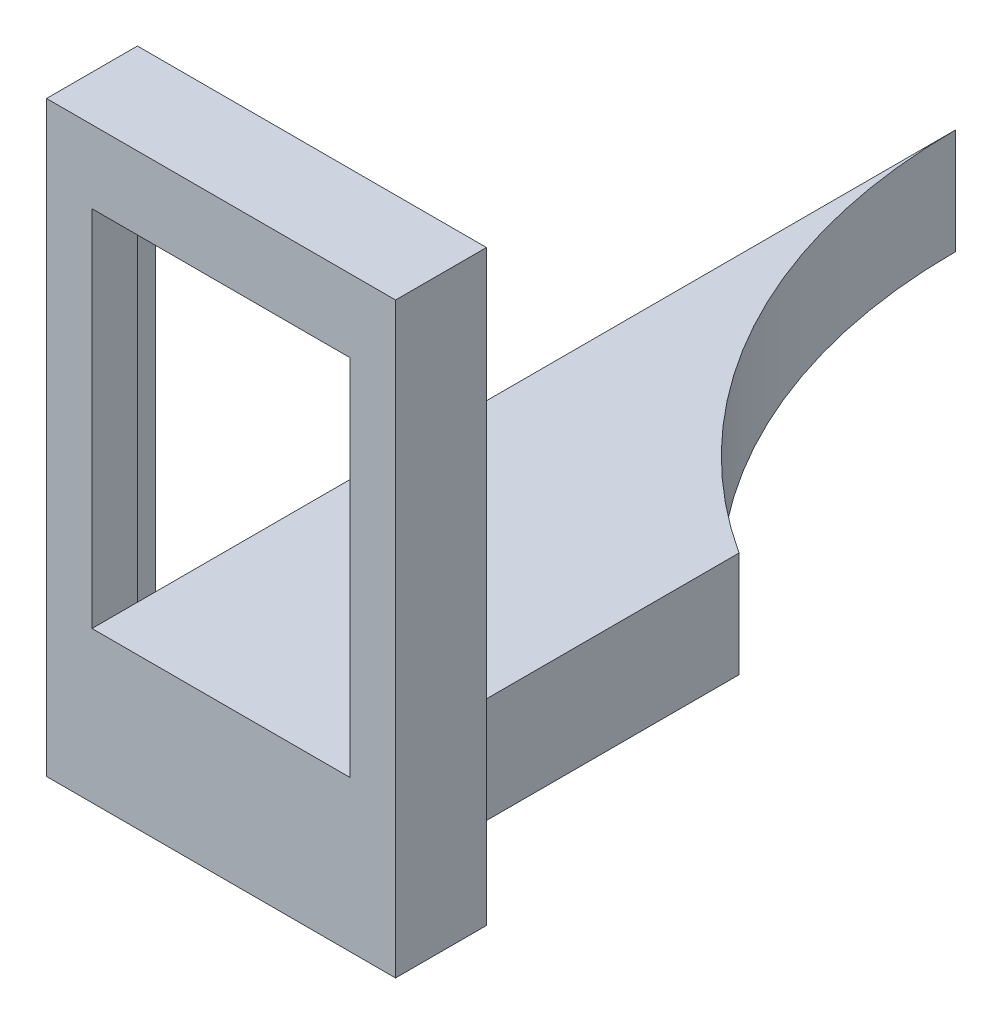
ISO-10303-21;
HEADER;
FILE_DESCRIPTION(('STEP AP214'),'2;1');
FILE_NAME('part.step','',(''),(''),'','','');
FILE_SCHEMA(('AUTOMOTIVE_DESIGN { 1 0 10303 214 1 1 1 1 }'));
ENDSEC;
DATA;
#1=APPLICATION_CONTEXT('core data for automotive mechanical design processes');
#2=APPLICATION_PROTOCOL_DEFINITION('international standard','automotive_design',2000,#1);
#3=PRODUCT_CONTEXT('',#1,'mechanical');
#4=PRODUCT('Part','Part','',(#3));
#5=PRODUCT_RELATED_PRODUCT_CATEGORY('part','',(#4));
#6=PRODUCT_DEFINITION_FORMATION('','',#4);
#7=PRODUCT_DEFINITION_CONTEXT('part definition',#1,'design');
#8=PRODUCT_DEFINITION('design','',#6,#7);
#9=PRODUCT_DEFINITION_SHAPE('','',#8);
#10=(LENGTH_UNIT() NAMED_UNIT(*) SI_UNIT(.MILLI.,.METRE.));
#11=(NAMED_UNIT(*) PLANE_ANGLE_UNIT() SI_UNIT($,.RADIAN.));
#12=(NAMED_UNIT(*) SI_UNIT($,.STERADIAN.) SOLID_ANGLE_UNIT());
#13=UNCERTAINTY_MEASURE_WITH_UNIT(LENGTH_MEASURE(1.E-05),#10,'distance_accuracy_value','');
#14=(GEOMETRIC_REPRESENTATION_CONTEXT(3) GLOBAL_UNCERTAINTY_ASSIGNED_CONTEXT((#13)) GLOBAL_UNIT_ASSIGNED_CONTEXT((#10,
#11,#12)) REPRESENTATION_CONTEXT('',''));
#15=CARTESIAN_POINT('',(0.,0.,0.));
#16=DIRECTION('',(0.,0.,1.));
#17=DIRECTION('',(1.,0.,0.));
#18=AXIS2_PLACEMENT_3D('',#15,#16,#17);
#19=CARTESIAN_POINT('',(0.,0.,-5.));
#20=DIRECTION('',(0.,0.,1.));
#21=DIRECTION('',(1.,0.,0.));
#22=AXIS2_PLACEMENT_3D('',#19,#20,#21);
#23=PLANE('',#22);
#24=DIRECTION('',(0.,1.,0.));
#25=VECTOR('',#24,1.);
#26=CARTESIAN_POINT('',(31.4,2.99999999999999,-5.));
#27=LINE('',#26,#25);
#28=CARTESIAN_POINT('',(31.4,2.99999999999999,-5.));
#29=VERTEX_POINT('',#28);
#30=CARTESIAN_POINT('',(31.4,14.6,-5.));
#31=VERTEX_POINT('',#30);
#32=EDGE_CURVE('E282',#29,#31,#27,.T.);
#33=ORIENTED_EDGE('',*,*,#32,.T.);
#34=CARTESIAN_POINT('',(31.4,54.6,-5.));
#35=VERTEX_POINT('',#34);
#36=EDGE_CURVE('E281',#31,#35,#27,.T.);
#37=ORIENTED_EDGE('',*,*,#36,.T.);
#38=DIRECTION('',(-1.,0.,0.));
#39=VECTOR('',#38,1.);
#40=CARTESIAN_POINT('',(31.4,54.6,-5.));
#41=LINE('',#40,#39);
#42=CARTESIAN_POINT('',(3.,54.6,-5.));
#43=VERTEX_POINT('',#42);
#44=EDGE_CURVE('E267',#35,#43,#41,.T.);
#45=ORIENTED_EDGE('',*,*,#44,.T.);
#46=DIRECTION('',(0.,-1.,0.));
#47=VECTOR('',#46,1.);
#48=CARTESIAN_POINT('',(3.,54.6,-5.));
#49=LINE('',#48,#47);
#50=CARTESIAN_POINT('',(3.,14.6,-5.));
#51=VERTEX_POINT('',#50);
#52=EDGE_CURVE('E273',#43,#51,#49,.T.);
#53=ORIENTED_EDGE('',*,*,#52,.T.);
#54=CARTESIAN_POINT('',(3.,2.99999999999999,-5.));
#55=VERTEX_POINT('',#54);
#56=EDGE_CURVE('E271',#51,#55,#49,.T.);
#57=ORIENTED_EDGE('',*,*,#56,.T.);
#58=DIRECTION('',(1.,0.,0.));
#59=VECTOR('',#58,1.);
#60=CARTESIAN_POINT('',(3.,2.99999999999999,-5.));
#61=LINE('',#60,#59);
#62=EDGE_CURVE('E277',#55,#29,#61,.T.);
#63=ORIENTED_EDGE('',*,*,#62,.T.);
#64=EDGE_LOOP('',(#33,#37,#45,#53,#57,#63));
#65=FACE_BOUND('',#64,.T.);
#66=DIRECTION('',(-1.,0.,0.));
#67=VECTOR('',#66,1.);
#68=CARTESIAN_POINT('',(34.4,60.6,-5.));
#69=LINE('',#68,#67);
#70=CARTESIAN_POINT('',(34.4,60.6,-5.));
#71=VERTEX_POINT('',#70);
#72=CARTESIAN_POINT('',(0.,60.6,-5.));
#73=VERTEX_POINT('',#72);
#74=EDGE_CURVE('E156',#71,#73,#69,.T.);
#75=ORIENTED_EDGE('',*,*,#74,.F.);
#76=DIRECTION('',(0.,1.,0.));
#77=VECTOR('',#76,1.);
#78=CARTESIAN_POINT('',(34.4,0.,-5.));
#79=LINE('',#78,#77);
#80=CARTESIAN_POINT('',(34.4,0.,-5.));
#81=VERTEX_POINT('',#80);
#82=EDGE_CURVE('E48',#81,#71,#79,.T.);
#83=ORIENTED_EDGE('',*,*,#82,.F.);
#84=DIRECTION('',(1.,0.,0.));
#85=VECTOR('',#84,1.);
#86=CARTESIAN_POINT('',(0.,0.,-5.));
#87=LINE('',#86,#85);
#88=CARTESIAN_POINT('',(0.,0.,-5.));
#89=VERTEX_POINT('',#88);
#90=EDGE_CURVE('E306',#89,#81,#87,.T.);
#91=ORIENTED_EDGE('',*,*,#90,.F.);
#92=DIRECTION('',(0.,-1.,0.));
#93=VECTOR('',#92,1.);
#94=CARTESIAN_POINT('',(0.,60.6,-5.));
#95=LINE('',#94,#93);
#96=EDGE_CURVE('E303',#73,#89,#95,.T.);
#97=ORIENTED_EDGE('',*,*,#96,.F.);
#98=EDGE_LOOP('',(#75,#83,#91,#97));
#99=FACE_BOUND('',#98,.T.);
#100=ADVANCED_FACE('F39',(#65,#99),#23,.F.);
#101=CARTESIAN_POINT('',(0.,0.,0.));
#102=DIRECTION('',(0.,0.,1.));
#103=DIRECTION('',(1.,0.,0.));
#104=AXIS2_PLACEMENT_3D('',#101,#102,#103);
#105=PLANE('',#104);
#106=DIRECTION('',(0.,1.,0.));
#107=VECTOR('',#106,1.);
#108=CARTESIAN_POINT('',(31.4,2.99999999999999,0.));
#109=LINE('',#108,#107);
#110=CARTESIAN_POINT('',(31.4,14.6,0.));
#111=VERTEX_POINT('',#110);
#112=CARTESIAN_POINT('',(31.4,54.6,0.));
#113=VERTEX_POINT('',#112);
#114=EDGE_CURVE('E272',#111,#113,#109,.T.);
#115=ORIENTED_EDGE('',*,*,#114,.F.);
#116=DIRECTION('',(-1.,0.,0.));
#117=VECTOR('',#116,1.);
#118=CARTESIAN_POINT('',(3.,14.6,0.));
#119=LINE('',#118,#117);
#120=CARTESIAN_POINT('',(3.,14.6,0.));
#121=VERTEX_POINT('',#120);
#122=EDGE_CURVE('E245',#111,#121,#119,.T.);
#123=ORIENTED_EDGE('',*,*,#122,.T.);
#124=DIRECTION('',(0.,-1.,0.));
#125=VECTOR('',#124,1.);
#126=CARTESIAN_POINT('',(3.,54.6,0.));
#127=LINE('',#126,#125);
#128=CARTESIAN_POINT('',(3.,54.6,0.));
#129=VERTEX_POINT('',#128);
#130=EDGE_CURVE('E289',#129,#121,#127,.T.);
#131=ORIENTED_EDGE('',*,*,#130,.F.);
#132=DIRECTION('',(-1.,0.,0.));
#133=VECTOR('',#132,1.);
#134=CARTESIAN_POINT('',(31.4,54.6,0.));
#135=LINE('',#134,#133);
#136=EDGE_CURVE('E258',#113,#129,#135,.T.);
#137=ORIENTED_EDGE('',*,*,#136,.F.);
#138=EDGE_LOOP('',(#115,#123,#131,#137));
#139=FACE_BOUND('',#138,.T.);
#140=DIRECTION('',(0.,-1.,0.));
#141=VECTOR('',#140,1.);
#142=CARTESIAN_POINT('',(-2.00000000000001,-2.,0.));
#143=LINE('',#142,#141);
#144=CARTESIAN_POINT('',(-2.00000000000001,62.6,0.));
#145=VERTEX_POINT('',#144);
#146=CARTESIAN_POINT('',(-2.00000000000001,-2.,0.));
#147=VERTEX_POINT('',#146);
#148=EDGE_CURVE('E186',#145,#147,#143,.T.);
#149=ORIENTED_EDGE('',*,*,#148,.T.);
#150=DIRECTION('',(1.,0.,0.));
#151=VECTOR('',#150,1.);
#152=CARTESIAN_POINT('',(-2.00000000000001,-2.,0.));
#153=LINE('',#152,#151);
#154=CARTESIAN_POINT('',(36.4,-2.,0.));
#155=VERTEX_POINT('',#154);
#156=EDGE_CURVE('E214',#147,#155,#153,.T.);
#157=ORIENTED_EDGE('',*,*,#156,.T.);
#158=DIRECTION('',(0.,1.,0.));
#159=VECTOR('',#158,1.);
#160=CARTESIAN_POINT('',(36.4,-2.,0.));
#161=LINE('',#160,#159);
#162=CARTESIAN_POINT('',(36.4,62.6,0.));
#163=VERTEX_POINT('',#162);
#164=EDGE_CURVE('E218',#155,#163,#161,.T.);
#165=ORIENTED_EDGE('',*,*,#164,.T.);
#166=DIRECTION('',(-1.,0.,0.));
#167=VECTOR('',#166,1.);
#168=CARTESIAN_POINT('',(-2.00000000000001,62.6,0.));
#169=LINE('',#168,#167);
#170=EDGE_CURVE('E198',#163,#145,#169,.T.);
#171=ORIENTED_EDGE('',*,*,#170,.T.);
#172=EDGE_LOOP('',(#149,#157,#165,#171));
#173=FACE_BOUND('',#172,.T.);
#174=ADVANCED_FACE('F41',(#139,#173),#105,.T.);
#175=CARTESIAN_POINT('',(31.4,54.6,-5.));
#176=DIRECTION('',(0.,1.,0.));
#177=DIRECTION('',(0.,0.,1.));
#178=AXIS2_PLACEMENT_3D('',#175,#176,#177);
#179=PLANE('',#178);
#180=ORIENTED_EDGE('',*,*,#136,.T.);
#181=DIRECTION('',(0.,0.,1.));
#182=VECTOR('',#181,1.);
#183=CARTESIAN_POINT('',(3.,54.6,-5.));
#184=LINE('',#183,#182);
#185=EDGE_CURVE('E286',#43,#129,#184,.T.);
#186=ORIENTED_EDGE('',*,*,#185,.F.);
#187=ORIENTED_EDGE('',*,*,#44,.F.);
#188=DIRECTION('',(0.,0.,1.));
#189=VECTOR('',#188,1.);
#190=CARTESIAN_POINT('',(31.4,54.6,-5.));
#191=LINE('',#190,#189);
#192=EDGE_CURVE('E294',#35,#113,#191,.T.);
#193=ORIENTED_EDGE('',*,*,#192,.T.);
#194=EDGE_LOOP('',(#180,#186,#187,#193));
#195=FACE_BOUND('',#194,.T.);
#196=ADVANCED_FACE('F330',(#195),#179,.F.);
#197=CARTESIAN_POINT('',(31.4,2.99999999999999,-5.));
#198=DIRECTION('',(1.,0.,0.));
#199=DIRECTION('',(0.,0.,-1.));
#200=AXIS2_PLACEMENT_3D('',#197,#198,#199);
#201=PLANE('',#200);
#202=ORIENTED_EDGE('',*,*,#36,.F.);
#203=DIRECTION('',(0.,0.,1.));
#204=VECTOR('',#203,1.);
#205=CARTESIAN_POINT('',(31.4,14.6,-95.));
#206=LINE('',#205,#204);
#207=EDGE_CURVE('E62',#31,#111,#206,.T.);
#208=ORIENTED_EDGE('',*,*,#207,.T.);
#209=ORIENTED_EDGE('',*,*,#114,.T.);
#210=ORIENTED_EDGE('',*,*,#192,.F.);
#211=EDGE_LOOP('',(#202,#208,#209,#210));
#212=FACE_BOUND('',#211,.T.);
#213=ADVANCED_FACE('F335',(#212),#201,.F.);
#214=CARTESIAN_POINT('',(3.,54.6,-5.));
#215=DIRECTION('',(-1.,0.,0.));
#216=DIRECTION('',(0.,-1.,0.));
#217=AXIS2_PLACEMENT_3D('',#214,#215,#216);
#218=PLANE('',#217);
#219=ORIENTED_EDGE('',*,*,#130,.T.);
#220=DIRECTION('',(0.,0.,-1.));
#221=VECTOR('',#220,1.);
#222=CARTESIAN_POINT('',(3.,14.6,-5.));
#223=LINE('',#222,#221);
#224=EDGE_CURVE('E11',#121,#51,#223,.T.);
#225=ORIENTED_EDGE('',*,*,#224,.T.);
#226=ORIENTED_EDGE('',*,*,#52,.F.);
#227=ORIENTED_EDGE('',*,*,#185,.T.);
#228=EDGE_LOOP('',(#219,#225,#226,#227));
#229=FACE_BOUND('',#228,.T.);
#230=ADVANCED_FACE('F337',(#229),#218,.F.);
#231=CARTESIAN_POINT('',(3.,2.99999999999999,-95.));
#232=DIRECTION('',(-1.,0.,0.));
#233=DIRECTION('',(0.,0.,1.));
#234=AXIS2_PLACEMENT_3D('',#231,#232,#233);
#235=PLANE('',#234);
#236=ORIENTED_EDGE('',*,*,#56,.F.);
#237=DIRECTION('',(0.,0.,1.));
#238=VECTOR('',#237,1.);
#239=CARTESIAN_POINT('',(3.,14.6,-95.));
#240=LINE('',#239,#238);
#241=CARTESIAN_POINT('',(3.00000000000001,14.6,-95.));
#242=VERTEX_POINT('',#241);
#243=EDGE_CURVE('E254',#242,#51,#240,.T.);
#244=ORIENTED_EDGE('',*,*,#243,.F.);
#245=DIRECTION('',(0.,-1.,0.));
#246=VECTOR('',#245,1.);
#247=CARTESIAN_POINT('',(3.,2.99999999999999,-95.));
#248=LINE('',#247,#246);
#249=CARTESIAN_POINT('',(3.,2.99999999999999,-95.));
#250=VERTEX_POINT('',#249);
#251=EDGE_CURVE('E246',#242,#250,#248,.T.);
#252=ORIENTED_EDGE('',*,*,#251,.T.);
#253=DIRECTION('',(0.,0.,1.));
#254=VECTOR('',#253,1.);
#255=CARTESIAN_POINT('',(3.,2.99999999999999,-95.));
#256=LINE('',#255,#254);
#257=EDGE_CURVE('E250',#250,#55,#256,.T.);
#258=ORIENTED_EDGE('',*,*,#257,.T.);
#259=EDGE_LOOP('',(#236,#244,#252,#258));
#260=FACE_BOUND('',#259,.T.);
#261=ADVANCED_FACE('F340',(#260),#235,.T.);
#262=CARTESIAN_POINT('',(31.4,2.99999999999999,-95.));
#263=DIRECTION('',(1.,0.,0.));
#264=DIRECTION('',(0.,0.,-1.));
#265=AXIS2_PLACEMENT_3D('',#262,#263,#264);
#266=PLANE('',#265);
#267=DIRECTION('',(0.,1.,0.));
#268=VECTOR('',#267,1.);
#269=CARTESIAN_POINT('',(31.4,-85.4,-42.7850596093417));
#270=LINE('',#269,#268);
#271=CARTESIAN_POINT('',(31.4,14.6,-42.7850596093417));
#272=VERTEX_POINT('',#271);
#273=CARTESIAN_POINT('',(31.4,2.99999999999999,-42.7850596093417));
#274=VERTEX_POINT('',#273);
#275=EDGE_CURVE('E242',#272,#274,#270,.F.);
#276=ORIENTED_EDGE('',*,*,#275,.F.);
#277=EDGE_CURVE('E55',#272,#31,#206,.T.);
#278=ORIENTED_EDGE('',*,*,#277,.T.);
#279=ORIENTED_EDGE('',*,*,#32,.F.);
#280=DIRECTION('',(0.,0.,1.));
#281=VECTOR('',#280,1.);
#282=CARTESIAN_POINT('',(31.4,2.99999999999999,-95.));
#283=LINE('',#282,#281);
#284=EDGE_CURVE('E261',#274,#29,#283,.T.);
#285=ORIENTED_EDGE('',*,*,#284,.F.);
#286=EDGE_LOOP('',(#276,#278,#279,#285));
#287=FACE_BOUND('',#286,.T.);
#288=ADVANCED_FACE('F346',(#287),#266,.T.);
#289=CARTESIAN_POINT('',(3.,2.99999999999999,-95.));
#290=DIRECTION('',(0.,-1.,0.));
#291=DIRECTION('',(0.,0.,-1.));
#292=AXIS2_PLACEMENT_3D('',#289,#290,#291);
#293=PLANE('',#292);
#294=CARTESIAN_POINT('',(65.2,2.99999999999999,-95.));
#295=DIRECTION('',(0.,-1.,0.));
#296=DIRECTION('',(0.,0.,-1.));
#297=AXIS2_PLACEMENT_3D('',#294,#295,#296);
#298=CIRCLE('',#297,62.2);
#299=EDGE_CURVE('E239',#274,#250,#298,.T.);
#300=ORIENTED_EDGE('',*,*,#299,.F.);
#301=ORIENTED_EDGE('',*,*,#284,.T.);
#302=ORIENTED_EDGE('',*,*,#62,.F.);
#303=ORIENTED_EDGE('',*,*,#257,.F.);
#304=EDGE_LOOP('',(#300,#301,#302,#303));
#305=FACE_BOUND('',#304,.T.);
#306=ADVANCED_FACE('F348',(#305),#293,.T.);
#307=CARTESIAN_POINT('',(3.,14.6,-95.));
#308=DIRECTION('',(0.,1.,0.));
#309=DIRECTION('',(0.,0.,1.));
#310=AXIS2_PLACEMENT_3D('',#307,#308,#309);
#311=PLANE('',#310);
#312=CARTESIAN_POINT('',(65.2,14.6,-95.));
#313=DIRECTION('',(0.,1.,0.));
#314=DIRECTION('',(0.,0.,1.));
#315=AXIS2_PLACEMENT_3D('',#312,#313,#314);
#316=CIRCLE('',#315,62.2);
#317=EDGE_CURVE('E228',#242,#272,#316,.T.);
#318=ORIENTED_EDGE('',*,*,#317,.F.);
#319=ORIENTED_EDGE('',*,*,#243,.T.);
#320=ORIENTED_EDGE('',*,*,#224,.F.);
#321=ORIENTED_EDGE('',*,*,#122,.F.);
#322=ORIENTED_EDGE('',*,*,#207,.F.);
#323=ORIENTED_EDGE('',*,*,#277,.F.);
#324=EDGE_LOOP('',(#318,#319,#320,#321,#322,#323));
#325=FACE_BOUND('',#324,.T.);
#326=ADVANCED_FACE('F351',(#325),#311,.T.);
#327=CARTESIAN_POINT('',(65.2,-85.4,-95.));
#328=DIRECTION('',(0.,1.,0.));
#329=DIRECTION('',(0.,0.,1.));
#330=AXIS2_PLACEMENT_3D('',#327,#328,#329);
#331=CYLINDRICAL_SURFACE('',#330,62.2);
#332=ORIENTED_EDGE('',*,*,#275,.T.);
#333=ORIENTED_EDGE('',*,*,#299,.T.);
#334=ORIENTED_EDGE('',*,*,#251,.F.);
#335=ORIENTED_EDGE('',*,*,#317,.T.);
#336=EDGE_LOOP('',(#332,#333,#334,#335));
#337=FACE_BOUND('',#336,.T.);
#338=ADVANCED_FACE('F357',(#337),#331,.F.);
#339=CARTESIAN_POINT('',(34.4,60.6,-10.));
#340=DIRECTION('',(0.,1.,0.));
#341=DIRECTION('',(-1.,0.,0.));
#342=AXIS2_PLACEMENT_3D('',#339,#340,#341);
#343=PLANE('',#342);
#344=DIRECTION('',(0.,0.,1.));
#345=VECTOR('',#344,1.);
#346=CARTESIAN_POINT('',(34.4,60.6,-10.));
#347=LINE('',#346,#345);
#348=CARTESIAN_POINT('',(34.4,60.6,-10.));
#349=VERTEX_POINT('',#348);
#350=EDGE_CURVE('E183',#349,#71,#347,.T.);
#351=ORIENTED_EDGE('',*,*,#350,.T.);
#352=ORIENTED_EDGE('',*,*,#74,.T.);
#353=DIRECTION('',(0.,0.,1.));
#354=VECTOR('',#353,1.);
#355=CARTESIAN_POINT('',(0.,60.6,-10.));
#356=LINE('',#355,#354);
#357=CARTESIAN_POINT('',(0.,60.6,-10.));
#358=VERTEX_POINT('',#357);
#359=EDGE_CURVE('E149',#358,#73,#356,.T.);
#360=ORIENTED_EDGE('',*,*,#359,.F.);
#361=DIRECTION('',(-1.,0.,0.));
#362=VECTOR('',#361,1.);
#363=CARTESIAN_POINT('',(34.4,60.6,-10.));
#364=LINE('',#363,#362);
#365=EDGE_CURVE('E154',#349,#358,#364,.T.);
#366=ORIENTED_EDGE('',*,*,#365,.F.);
#367=EDGE_LOOP('',(#351,#352,#360,#366));
#368=FACE_BOUND('',#367,.T.);
#369=ADVANCED_FACE('F152',(#368),#343,.F.);
#370=CARTESIAN_POINT('',(34.4,0.,-10.));
#371=DIRECTION('',(1.,0.,0.));
#372=DIRECTION('',(0.,0.,-1.));
#373=AXIS2_PLACEMENT_3D('',#370,#371,#372);
#374=PLANE('',#373);
#375=DIRECTION('',(0.,0.,1.));
#376=VECTOR('',#375,1.);
#377=CARTESIAN_POINT('',(34.4,0.,-10.));
#378=LINE('',#377,#376);
#379=CARTESIAN_POINT('',(34.4,0.,-10.));
#380=VERTEX_POINT('',#379);
#381=EDGE_CURVE('E187',#380,#81,#378,.T.);
#382=ORIENTED_EDGE('',*,*,#381,.T.);
#383=ORIENTED_EDGE('',*,*,#82,.T.);
#384=ORIENTED_EDGE('',*,*,#350,.F.);
#385=DIRECTION('',(0.,1.,0.));
#386=VECTOR('',#385,1.);
#387=CARTESIAN_POINT('',(34.4,0.,-10.));
#388=LINE('',#387,#386);
#389=EDGE_CURVE('E161',#380,#349,#388,.T.);
#390=ORIENTED_EDGE('',*,*,#389,.F.);
#391=EDGE_LOOP('',(#382,#383,#384,#390));
#392=FACE_BOUND('',#391,.T.);
#393=ADVANCED_FACE('F312',(#392),#374,.F.);
#394=CARTESIAN_POINT('',(0.,0.,-10.));
#395=DIRECTION('',(0.,-1.,0.));
#396=DIRECTION('',(1.,0.,0.));
#397=AXIS2_PLACEMENT_3D('',#394,#395,#396);
#398=PLANE('',#397);
#399=DIRECTION('',(0.,0.,1.));
#400=VECTOR('',#399,1.);
#401=CARTESIAN_POINT('',(0.,0.,-10.));
#402=LINE('',#401,#400);
#403=CARTESIAN_POINT('',(0.,0.,-10.));
#404=VERTEX_POINT('',#403);
#405=EDGE_CURVE('E160',#404,#89,#402,.T.);
#406=ORIENTED_EDGE('',*,*,#405,.T.);
#407=ORIENTED_EDGE('',*,*,#90,.T.);
#408=ORIENTED_EDGE('',*,*,#381,.F.);
#409=DIRECTION('',(1.,0.,0.));
#410=VECTOR('',#409,1.);
#411=CARTESIAN_POINT('',(0.,0.,-10.));
#412=LINE('',#411,#410);
#413=EDGE_CURVE('E171',#404,#380,#412,.T.);
#414=ORIENTED_EDGE('',*,*,#413,.F.);
#415=EDGE_LOOP('',(#406,#407,#408,#414));
#416=FACE_BOUND('',#415,.T.);
#417=ADVANCED_FACE('F315',(#416),#398,.F.);
#418=CARTESIAN_POINT('',(0.,60.6,-10.));
#419=DIRECTION('',(-1.,0.,0.));
#420=DIRECTION('',(0.,-1.,0.));
#421=AXIS2_PLACEMENT_3D('',#418,#419,#420);
#422=PLANE('',#421);
#423=ORIENTED_EDGE('',*,*,#359,.T.);
#424=ORIENTED_EDGE('',*,*,#96,.T.);
#425=ORIENTED_EDGE('',*,*,#405,.F.);
#426=DIRECTION('',(0.,-1.,0.));
#427=VECTOR('',#426,1.);
#428=CARTESIAN_POINT('',(0.,60.6,-10.));
#429=LINE('',#428,#427);
#430=EDGE_CURVE('E165',#358,#404,#429,.T.);
#431=ORIENTED_EDGE('',*,*,#430,.F.);
#432=EDGE_LOOP('',(#423,#424,#425,#431));
#433=FACE_BOUND('',#432,.T.);
#434=ADVANCED_FACE('F166',(#433),#422,.F.);
#435=CARTESIAN_POINT('',(-2.00000000000001,-2.,-10.));
#436=DIRECTION('',(-1.,0.,0.));
#437=DIRECTION('',(0.,0.,1.));
#438=AXIS2_PLACEMENT_3D('',#435,#436,#437);
#439=PLANE('',#438);
#440=ORIENTED_EDGE('',*,*,#148,.F.);
#441=DIRECTION('',(0.,0.,1.));
#442=VECTOR('',#441,1.);
#443=CARTESIAN_POINT('',(-2.00000000000001,62.6,-10.));
#444=LINE('',#443,#442);
#445=CARTESIAN_POINT('',(-2.00000000000001,62.6,-10.));
#446=VERTEX_POINT('',#445);
#447=EDGE_CURVE('E225',#446,#145,#444,.T.);
#448=ORIENTED_EDGE('',*,*,#447,.F.);
#449=DIRECTION('',(0.,-1.,0.));
#450=VECTOR('',#449,1.);
#451=CARTESIAN_POINT('',(-2.00000000000001,-2.,-10.));
#452=LINE('',#451,#450);
#453=CARTESIAN_POINT('',(-2.00000000000001,-2.,-10.));
#454=VERTEX_POINT('',#453);
#455=EDGE_CURVE('E193',#446,#454,#452,.T.);
#456=ORIENTED_EDGE('',*,*,#455,.T.);
#457=DIRECTION('',(0.,0.,1.));
#458=VECTOR('',#457,1.);
#459=CARTESIAN_POINT('',(-2.00000000000001,-2.,-10.));
#460=LINE('',#459,#458);
#461=EDGE_CURVE('E210',#454,#147,#460,.T.);
#462=ORIENTED_EDGE('',*,*,#461,.T.);
#463=EDGE_LOOP('',(#440,#448,#456,#462));
#464=FACE_BOUND('',#463,.T.);
#465=ADVANCED_FACE('F322',(#464),#439,.T.);
#466=CARTESIAN_POINT('',(-2.00000000000001,62.6,-10.));
#467=DIRECTION('',(0.,1.,0.));
#468=DIRECTION('',(0.,0.,1.));
#469=AXIS2_PLACEMENT_3D('',#466,#467,#468);
#470=PLANE('',#469);
#471=ORIENTED_EDGE('',*,*,#170,.F.);
#472=DIRECTION('',(0.,0.,1.));
#473=VECTOR('',#472,1.);
#474=CARTESIAN_POINT('',(36.4,62.6,-10.));
#475=LINE('',#474,#473);
#476=CARTESIAN_POINT('',(36.4,62.6,-10.));
#477=VERTEX_POINT('',#476);
#478=EDGE_CURVE('E229',#477,#163,#475,.T.);
#479=ORIENTED_EDGE('',*,*,#478,.F.);
#480=DIRECTION('',(-1.,0.,0.));
#481=VECTOR('',#480,1.);
#482=CARTESIAN_POINT('',(-2.00000000000001,62.6,-10.));
#483=LINE('',#482,#481);
#484=EDGE_CURVE('E206',#477,#446,#483,.T.);
#485=ORIENTED_EDGE('',*,*,#484,.T.);
#486=ORIENTED_EDGE('',*,*,#447,.T.);
#487=EDGE_LOOP('',(#471,#479,#485,#486));
#488=FACE_BOUND('',#487,.T.);
#489=ADVANCED_FACE('F364',(#488),#470,.T.);
#490=CARTESIAN_POINT('',(36.4,-2.,-10.));
#491=DIRECTION('',(1.,0.,0.));
#492=DIRECTION('',(0.,0.,-1.));
#493=AXIS2_PLACEMENT_3D('',#490,#491,#492);
#494=PLANE('',#493);
#495=ORIENTED_EDGE('',*,*,#164,.F.);
#496=DIRECTION('',(0.,0.,1.));
#497=VECTOR('',#496,1.);
#498=CARTESIAN_POINT('',(36.4,-2.,-10.));
#499=LINE('',#498,#497);
#500=CARTESIAN_POINT('',(36.4,-2.,-10.));
#501=VERTEX_POINT('',#500);
#502=EDGE_CURVE('E232',#501,#155,#499,.T.);
#503=ORIENTED_EDGE('',*,*,#502,.F.);
#504=DIRECTION('',(0.,1.,0.));
#505=VECTOR('',#504,1.);
#506=CARTESIAN_POINT('',(36.4,-2.,-10.));
#507=LINE('',#506,#505);
#508=EDGE_CURVE('E202',#501,#477,#507,.T.);
#509=ORIENTED_EDGE('',*,*,#508,.T.);
#510=ORIENTED_EDGE('',*,*,#478,.T.);
#511=EDGE_LOOP('',(#495,#503,#509,#510));
#512=FACE_BOUND('',#511,.T.);
#513=ADVANCED_FACE('F369',(#512),#494,.T.);
#514=CARTESIAN_POINT('',(-2.00000000000001,-2.,-10.));
#515=DIRECTION('',(0.,-1.,0.));
#516=DIRECTION('',(0.,0.,-1.));
#517=AXIS2_PLACEMENT_3D('',#514,#515,#516);
#518=PLANE('',#517);
#519=ORIENTED_EDGE('',*,*,#156,.F.);
#520=ORIENTED_EDGE('',*,*,#461,.F.);
#521=DIRECTION('',(1.,0.,0.));
#522=VECTOR('',#521,1.);
#523=CARTESIAN_POINT('',(-2.00000000000001,-2.,-10.));
#524=LINE('',#523,#522);
#525=EDGE_CURVE('E197',#454,#501,#524,.T.);
#526=ORIENTED_EDGE('',*,*,#525,.T.);
#527=ORIENTED_EDGE('',*,*,#502,.T.);
#528=EDGE_LOOP('',(#519,#520,#526,#527));
#529=FACE_BOUND('',#528,.T.);
#530=ADVANCED_FACE('F366',(#529),#518,.T.);
#531=CARTESIAN_POINT('',(0.,0.,-10.));
#532=DIRECTION('',(0.,0.,-1.));
#533=DIRECTION('',(-1.,0.,0.));
#534=AXIS2_PLACEMENT_3D('',#531,#532,#533);
#535=PLANE('',#534);
#536=ORIENTED_EDGE('',*,*,#365,.T.);
#537=ORIENTED_EDGE('',*,*,#430,.T.);
#538=ORIENTED_EDGE('',*,*,#413,.T.);
#539=ORIENTED_EDGE('',*,*,#389,.T.);
#540=EDGE_LOOP('',(#536,#537,#538,#539));
#541=FACE_BOUND('',#540,.T.);
#542=ORIENTED_EDGE('',*,*,#455,.F.);
#543=ORIENTED_EDGE('',*,*,#484,.F.);
#544=ORIENTED_EDGE('',*,*,#508,.F.);
#545=ORIENTED_EDGE('',*,*,#525,.F.);
#546=EDGE_LOOP('',(#542,#543,#544,#545));
#547=FACE_BOUND('',#546,.T.);
#548=ADVANCED_FACE('F173',(#541,#547),#535,.T.);
#549=CLOSED_SHELL('',(#100,#174,#196,#213,#230,#261,#288,#306,#326,#338,#369,#393,#417,#434,
#465,#489,#513,#530,#548));
#550=MANIFOLD_SOLID_BREP('B2',#549);
#551=ADVANCED_BREP_SHAPE_REPRESENTATION('',(#18,#550),#14);
#552=SHAPE_DEFINITION_REPRESENTATION(#9,#551);
ENDSEC;
END-ISO-10303-21;
